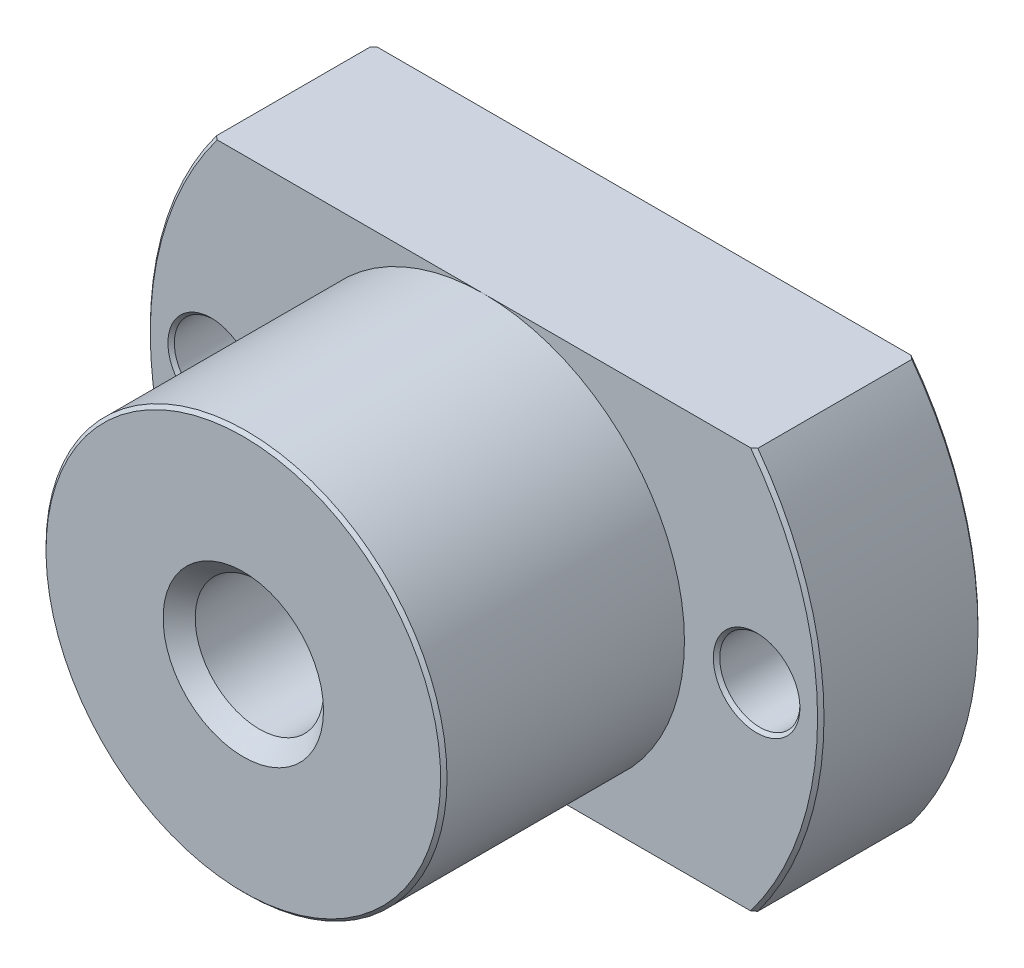
ISO-10303-21;
HEADER;
FILE_DESCRIPTION(('STEP AP214'),'2;1');
FILE_NAME('part.step','',(''),(''),'','','');
FILE_SCHEMA(('AUTOMOTIVE_DESIGN { 1 0 10303 214 1 1 1 1 }'));
ENDSEC;
DATA;
#1=APPLICATION_CONTEXT('core data for automotive mechanical design processes');
#2=APPLICATION_PROTOCOL_DEFINITION('international standard','automotive_design',2000,#1);
#3=PRODUCT_CONTEXT('',#1,'mechanical');
#4=PRODUCT('Part','Part','',(#3));
#5=PRODUCT_RELATED_PRODUCT_CATEGORY('part','',(#4));
#6=PRODUCT_DEFINITION_FORMATION('','',#4);
#7=PRODUCT_DEFINITION_CONTEXT('part definition',#1,'design');
#8=PRODUCT_DEFINITION('design','',#6,#7);
#9=PRODUCT_DEFINITION_SHAPE('','',#8);
#10=(LENGTH_UNIT() NAMED_UNIT(*) SI_UNIT(.MILLI.,.METRE.));
#11=(NAMED_UNIT(*) PLANE_ANGLE_UNIT() SI_UNIT($,.RADIAN.));
#12=(NAMED_UNIT(*) SI_UNIT($,.STERADIAN.) SOLID_ANGLE_UNIT());
#13=UNCERTAINTY_MEASURE_WITH_UNIT(LENGTH_MEASURE(1.E-05),#10,'distance_accuracy_value','');
#14=(GEOMETRIC_REPRESENTATION_CONTEXT(3) GLOBAL_UNCERTAINTY_ASSIGNED_CONTEXT((#13)) GLOBAL_UNIT_ASSIGNED_CONTEXT((#10,
#11,#12)) REPRESENTATION_CONTEXT('',''));
#15=CARTESIAN_POINT('',(0.,0.,0.));
#16=DIRECTION('',(0.,0.,1.));
#17=DIRECTION('',(1.,0.,0.));
#18=AXIS2_PLACEMENT_3D('',#15,#16,#17);
#19=CARTESIAN_POINT('',(0.,0.,24.8));
#20=DIRECTION('',(0.,0.,-1.));
#21=DIRECTION('',(0.,1.,0.));
#22=AXIS2_PLACEMENT_3D('',#19,#20,#21);
#23=CONICAL_SURFACE('',#22,12.5,0.785398163397448);
#24=CARTESIAN_POINT('',(0.,0.,25.));
#25=DIRECTION('',(0.,0.,-1.));
#26=DIRECTION('',(0.,1.,0.));
#27=AXIS2_PLACEMENT_3D('',#24,#25,#26);
#28=CIRCLE('',#27,12.3);
#29=CARTESIAN_POINT('',(0.,12.3,25.));
#30=VERTEX_POINT('',#29);
#31=EDGE_CURVE('E20',#30,#30,#28,.F.);
#32=ORIENTED_EDGE('',*,*,#31,.F.);
#33=EDGE_LOOP('',(#32));
#34=FACE_BOUND('',#33,.T.);
#35=CARTESIAN_POINT('',(0.,0.,24.8));
#36=DIRECTION('',(0.,0.,1.));
#37=DIRECTION('',(0.,-1.,0.));
#38=AXIS2_PLACEMENT_3D('',#35,#36,#37);
#39=CIRCLE('',#38,12.5);
#40=CARTESIAN_POINT('',(0.,-12.5,24.8));
#41=VERTEX_POINT('',#40);
#42=EDGE_CURVE('E95',#41,#41,#39,.F.);
#43=ORIENTED_EDGE('',*,*,#42,.F.);
#44=EDGE_LOOP('',(#43));
#45=FACE_BOUND('',#44,.T.);
#46=ADVANCED_FACE('F17',(#34,#45),#23,.T.);
#47=CARTESIAN_POINT('',(8.65,0.,25.));
#48=DIRECTION('',(0.,0.,1.));
#49=DIRECTION('',(0.,-1.,0.));
#50=AXIS2_PLACEMENT_3D('',#47,#48,#49);
#51=PLANE('',#50);
#52=ORIENTED_EDGE('',*,*,#31,.T.);
#53=EDGE_LOOP('',(#52));
#54=FACE_BOUND('',#53,.T.);
#55=CARTESIAN_POINT('',(0.,0.,24.9999999999773));
#56=DIRECTION('',(0.,0.,1.));
#57=DIRECTION('',(1.,0.,0.));
#58=AXIS2_PLACEMENT_3D('',#55,#56,#57);
#59=CIRCLE('',#58,4.99999999999545);
#60=CARTESIAN_POINT('',(4.99999999999545,0.,24.9999999999773));
#61=VERTEX_POINT('',#60);
#62=EDGE_CURVE('E142',#61,#61,#59,.F.);
#63=ORIENTED_EDGE('',*,*,#62,.T.);
#64=EDGE_LOOP('',(#63));
#65=FACE_BOUND('',#64,.T.);
#66=ADVANCED_FACE('F295',(#54,#65),#51,.T.);
#67=CARTESIAN_POINT('',(-17.,0.,10.0000000000477));
#68=DIRECTION('',(0.,0.,1.));
#69=DIRECTION('',(1.,0.,0.));
#70=AXIS2_PLACEMENT_3D('',#67,#68,#69);
#71=CONICAL_SURFACE('',#70,2.7000000000653,0.785398163397448);
#72=CARTESIAN_POINT('',(-17.,0.,10.0000000000477));
#73=DIRECTION('',(0.,0.,1.));
#74=DIRECTION('',(1.,0.,0.));
#75=AXIS2_PLACEMENT_3D('',#72,#73,#74);
#76=CIRCLE('',#75,2.7000000000653);
#77=CARTESIAN_POINT('',(-14.2999999999347,0.,10.0000000000477));
#78=VERTEX_POINT('',#77);
#79=EDGE_CURVE('E138',#78,#78,#76,.F.);
#80=ORIENTED_EDGE('',*,*,#79,.F.);
#81=EDGE_LOOP('',(#80));
#82=FACE_BOUND('',#81,.T.);
#83=CARTESIAN_POINT('',(-17.,0.,9.8));
#84=DIRECTION('',(0.,0.,1.));
#85=DIRECTION('',(0.,-1.,0.));
#86=AXIS2_PLACEMENT_3D('',#83,#84,#85);
#87=CIRCLE('',#86,2.5);
#88=CARTESIAN_POINT('',(-17.,-2.5,9.8));
#89=VERTEX_POINT('',#88);
#90=EDGE_CURVE('E135',#89,#89,#87,.F.);
#91=ORIENTED_EDGE('',*,*,#90,.T.);
#92=EDGE_LOOP('',(#91));
#93=FACE_BOUND('',#92,.T.);
#94=ADVANCED_FACE('F286',(#82,#93),#71,.F.);
#95=CARTESIAN_POINT('',(17.,0.,10.0000000000477));
#96=DIRECTION('',(0.,0.,1.));
#97=DIRECTION('',(1.,0.,0.));
#98=AXIS2_PLACEMENT_3D('',#95,#96,#97);
#99=CONICAL_SURFACE('',#98,2.7000000000653,0.785398163397448);
#100=CARTESIAN_POINT('',(17.,0.,10.0000000000477));
#101=DIRECTION('',(0.,0.,1.));
#102=DIRECTION('',(1.,0.,0.));
#103=AXIS2_PLACEMENT_3D('',#100,#101,#102);
#104=CIRCLE('',#103,2.7000000000653);
#105=CARTESIAN_POINT('',(19.7000000000653,0.,10.0000000000477));
#106=VERTEX_POINT('',#105);
#107=EDGE_CURVE('E106',#106,#106,#104,.F.);
#108=ORIENTED_EDGE('',*,*,#107,.F.);
#109=EDGE_LOOP('',(#108));
#110=FACE_BOUND('',#109,.T.);
#111=CARTESIAN_POINT('',(17.,0.,9.8));
#112=DIRECTION('',(0.,0.,1.));
#113=DIRECTION('',(0.,-1.,0.));
#114=AXIS2_PLACEMENT_3D('',#111,#112,#113);
#115=CIRCLE('',#114,2.5);
#116=CARTESIAN_POINT('',(17.,-2.5,9.8));
#117=VERTEX_POINT('',#116);
#118=EDGE_CURVE('E139',#117,#117,#115,.F.);
#119=ORIENTED_EDGE('',*,*,#118,.T.);
#120=EDGE_LOOP('',(#119));
#121=FACE_BOUND('',#120,.T.);
#122=ADVANCED_FACE('F283',(#110,#121),#99,.F.);
#123=CARTESIAN_POINT('',(0.,0.,17.4));
#124=DIRECTION('',(0.,0.,1.));
#125=DIRECTION('',(0.,-1.,0.));
#126=AXIS2_PLACEMENT_3D('',#123,#124,#125);
#127=CYLINDRICAL_SURFACE('',#126,12.5);
#128=ORIENTED_EDGE('',*,*,#42,.T.);
#129=EDGE_LOOP('',(#128));
#130=FACE_BOUND('',#129,.T.);
#131=CARTESIAN_POINT('',(0.,0.,10.));
#132=DIRECTION('',(0.,0.,1.));
#133=DIRECTION('',(0.,-1.,0.));
#134=AXIS2_PLACEMENT_3D('',#131,#132,#133);
#135=CIRCLE('',#134,12.5);
#136=CARTESIAN_POINT('',(0.,-12.5,10.));
#137=VERTEX_POINT('',#136);
#138=CARTESIAN_POINT('',(0.,12.5,10.));
#139=VERTEX_POINT('',#138);
#140=EDGE_CURVE('E107',#137,#139,#135,.F.);
#141=ORIENTED_EDGE('',*,*,#140,.F.);
#142=CARTESIAN_POINT('',(0.,0.,10.));
#143=DIRECTION('',(0.,0.,1.));
#144=DIRECTION('',(0.,-1.,0.));
#145=AXIS2_PLACEMENT_3D('',#142,#143,#144);
#146=CIRCLE('',#145,12.5);
#147=EDGE_CURVE('E132',#139,#137,#146,.F.);
#148=ORIENTED_EDGE('',*,*,#147,.F.);
#149=EDGE_LOOP('',(#141,#148));
#150=FACE_BOUND('',#149,.T.);
#151=ADVANCED_FACE('F285',(#130,#150),#127,.T.);
#152=CARTESIAN_POINT('',(0.,0.,9.8));
#153=DIRECTION('',(0.,0.,-1.));
#154=DIRECTION('',(0.,1.,0.));
#155=AXIS2_PLACEMENT_3D('',#152,#153,#154);
#156=CONICAL_SURFACE('',#155,21.,0.78539816339744);
#157=CARTESIAN_POINT('',(-16.6249812029969,12.5,10.));
#158=CARTESIAN_POINT('',(-16.6666171887382,12.5,9.96672075496622));
#159=CARTESIAN_POINT('',(-16.7082315006251,12.5,9.93341446574889));
#160=CARTESIAN_POINT('',(-16.7914167765213,12.5,9.86674779908201));
#161=CARTESIAN_POINT('',(-16.8329877405309,12.5,9.83338742163267));
#162=CARTESIAN_POINT('',(-16.8745370306862,12.5,9.8));
#163=B_SPLINE_CURVE_WITH_KNOTS('',3,(#157,#158,#159,#160,#161,#162),.UNSPECIFIED.,.F.,.F.,(4,2,
4),(0.,0.159904780094797,0.31980955954266),.UNSPECIFIED.);
#164=CARTESIAN_POINT('',(-16.6249812029969,12.5,10.));
#165=VERTEX_POINT('',#164);
#166=CARTESIAN_POINT('',(-16.8745370306862,12.5,9.8));
#167=VERTEX_POINT('',#166);
#168=EDGE_CURVE('E144',#165,#167,#163,.T.);
#169=ORIENTED_EDGE('',*,*,#168,.T.);
#170=CARTESIAN_POINT('',(0.,0.,9.8));
#171=DIRECTION('',(0.,0.,1.));
#172=DIRECTION('',(0.,-1.,0.));
#173=AXIS2_PLACEMENT_3D('',#170,#171,#172);
#174=CIRCLE('',#173,21.);
#175=CARTESIAN_POINT('',(-16.8745370306862,-12.5,9.8));
#176=VERTEX_POINT('',#175);
#177=EDGE_CURVE('E84',#176,#167,#174,.F.);
#178=ORIENTED_EDGE('',*,*,#177,.F.);
#179=CARTESIAN_POINT('',(-16.8745370306862,-12.5,9.8));
#180=CARTESIAN_POINT('',(-16.8329877405309,-12.5,9.83338742163267));
#181=CARTESIAN_POINT('',(-16.7914167765213,-12.5,9.86674779908201));
#182=CARTESIAN_POINT('',(-16.7082315006251,-12.5,9.93341446574889));
#183=CARTESIAN_POINT('',(-16.6666171887382,-12.5,9.96672075496622));
#184=CARTESIAN_POINT('',(-16.6249812029969,-12.5,10.));
#185=B_SPLINE_CURVE_WITH_KNOTS('',3,(#179,#180,#181,#182,#183,#184),.UNSPECIFIED.,.F.,.F.,(4,2,
4),(0.,0.159904779447861,0.319809559542655),.UNSPECIFIED.);
#186=CARTESIAN_POINT('',(-16.6249812029969,-12.5,10.));
#187=VERTEX_POINT('',#186);
#188=EDGE_CURVE('E86',#176,#187,#185,.T.);
#189=ORIENTED_EDGE('',*,*,#188,.T.);
#190=CARTESIAN_POINT('',(0.,0.,10.));
#191=DIRECTION('',(0.,0.,-1.));
#192=DIRECTION('',(0.,1.,0.));
#193=AXIS2_PLACEMENT_3D('',#190,#191,#192);
#194=CIRCLE('',#193,20.8);
#195=EDGE_CURVE('E89',#165,#187,#194,.F.);
#196=ORIENTED_EDGE('',*,*,#195,.F.);
#197=EDGE_LOOP('',(#169,#178,#189,#196));
#198=FACE_BOUND('',#197,.T.);
#199=ADVANCED_FACE('F88',(#198),#156,.T.);
#200=CARTESIAN_POINT('',(0.,0.,9.8));
#201=DIRECTION('',(0.,0.,-1.));
#202=DIRECTION('',(0.,1.,0.));
#203=AXIS2_PLACEMENT_3D('',#200,#201,#202);
#204=CONICAL_SURFACE('',#203,21.,0.78539816339744);
#205=CARTESIAN_POINT('',(16.6249812029969,-12.5,10.));
#206=CARTESIAN_POINT('',(16.6666171887382,-12.5,9.96672075496622));
#207=CARTESIAN_POINT('',(16.7082315006251,-12.5,9.93341446574889));
#208=CARTESIAN_POINT('',(16.7914167765213,-12.5,9.86674779908201));
#209=CARTESIAN_POINT('',(16.8329877405309,-12.5,9.83338742163267));
#210=CARTESIAN_POINT('',(16.8745370306862,-12.5,9.8));
#211=B_SPLINE_CURVE_WITH_KNOTS('',3,(#205,#206,#207,#208,#209,#210),.UNSPECIFIED.,.F.,.F.,(4,2,
4),(0.,0.159904780094797,0.319809559542658),.UNSPECIFIED.);
#212=CARTESIAN_POINT('',(16.6249812029969,-12.5,10.));
#213=VERTEX_POINT('',#212);
#214=CARTESIAN_POINT('',(16.8745370306862,-12.5,9.8));
#215=VERTEX_POINT('',#214);
#216=EDGE_CURVE('E189',#213,#215,#211,.T.);
#217=ORIENTED_EDGE('',*,*,#216,.T.);
#218=CARTESIAN_POINT('',(0.,0.,9.8));
#219=DIRECTION('',(0.,0.,1.));
#220=DIRECTION('',(0.,-1.,0.));
#221=AXIS2_PLACEMENT_3D('',#218,#219,#220);
#222=CIRCLE('',#221,21.);
#223=CARTESIAN_POINT('',(16.8745370306862,12.5,9.8));
#224=VERTEX_POINT('',#223);
#225=EDGE_CURVE('E130',#224,#215,#222,.F.);
#226=ORIENTED_EDGE('',*,*,#225,.F.);
#227=CARTESIAN_POINT('',(16.8745370306862,12.5,9.8));
#228=CARTESIAN_POINT('',(16.8329877405309,12.5,9.83338742163267));
#229=CARTESIAN_POINT('',(16.7914167765213,12.5,9.86674779908201));
#230=CARTESIAN_POINT('',(16.7082315006251,12.5,9.93341446574889));
#231=CARTESIAN_POINT('',(16.6666171887382,12.5,9.96672075496622));
#232=CARTESIAN_POINT('',(16.6249812029969,12.5,9.99999999999999));
#233=B_SPLINE_CURVE_WITH_KNOTS('',3,(#227,#228,#229,#230,#231,#232),.UNSPECIFIED.,.F.,.F.,(4,2,
4),(0.,0.159904779447861,0.319809559542654),.UNSPECIFIED.);
#234=CARTESIAN_POINT('',(16.6249812029969,12.5,10.));
#235=VERTEX_POINT('',#234);
#236=EDGE_CURVE('E221',#224,#235,#233,.T.);
#237=ORIENTED_EDGE('',*,*,#236,.T.);
#238=CARTESIAN_POINT('',(0.,0.,10.));
#239=DIRECTION('',(0.,0.,-1.));
#240=DIRECTION('',(0.,1.,0.));
#241=AXIS2_PLACEMENT_3D('',#238,#239,#240);
#242=CIRCLE('',#241,20.8);
#243=EDGE_CURVE('E211',#213,#235,#242,.F.);
#244=ORIENTED_EDGE('',*,*,#243,.F.);
#245=EDGE_LOOP('',(#217,#226,#237,#244));
#246=FACE_BOUND('',#245,.T.);
#247=ADVANCED_FACE('F233',(#246),#204,.T.);
#248=CARTESIAN_POINT('',(0.,0.,24.9999999999773));
#249=DIRECTION('',(0.,0.,1.));
#250=DIRECTION('',(1.,0.,0.));
#251=AXIS2_PLACEMENT_3D('',#248,#249,#250);
#252=CONICAL_SURFACE('',#251,4.99999999999545,0.785398163397448);
#253=CARTESIAN_POINT('',(0.,0.,24.));
#254=DIRECTION('',(0.,0.,1.));
#255=DIRECTION('',(0.,-1.,0.));
#256=AXIS2_PLACEMENT_3D('',#253,#254,#255);
#257=CIRCLE('',#256,4.);
#258=CARTESIAN_POINT('',(0.,-4.,24.));
#259=VERTEX_POINT('',#258);
#260=EDGE_CURVE('E127',#259,#259,#257,.F.);
#261=ORIENTED_EDGE('',*,*,#260,.T.);
#262=EDGE_LOOP('',(#261));
#263=FACE_BOUND('',#262,.T.);
#264=ORIENTED_EDGE('',*,*,#62,.F.);
#265=EDGE_LOOP('',(#264));
#266=FACE_BOUND('',#265,.T.);
#267=ADVANCED_FACE('F279',(#263,#266),#252,.F.);
#268=CARTESIAN_POINT('',(17.,0.,5.));
#269=DIRECTION('',(0.,0.,1.));
#270=DIRECTION('',(0.,-1.,0.));
#271=AXIS2_PLACEMENT_3D('',#268,#269,#270);
#272=CYLINDRICAL_SURFACE('',#271,2.5);
#273=CARTESIAN_POINT('',(17.,0.,0.200000000006639));
#274=DIRECTION('',(0.,0.,-1.));
#275=DIRECTION('',(-1.,0.,0.));
#276=AXIS2_PLACEMENT_3D('',#273,#274,#275);
#277=CIRCLE('',#276,2.49999999994498);
#278=CARTESIAN_POINT('',(14.500000000055,0.,0.200000000006639));
#279=VERTEX_POINT('',#278);
#280=EDGE_CURVE('E124',#279,#279,#277,.T.);
#281=ORIENTED_EDGE('',*,*,#280,.T.);
#282=EDGE_LOOP('',(#281));
#283=FACE_BOUND('',#282,.T.);
#284=ORIENTED_EDGE('',*,*,#118,.F.);
#285=EDGE_LOOP('',(#284));
#286=FACE_BOUND('',#285,.T.);
#287=ADVANCED_FACE('F275',(#283,#286),#272,.F.);
#288=CARTESIAN_POINT('',(-17.,0.,5.));
#289=DIRECTION('',(0.,0.,1.));
#290=DIRECTION('',(0.,-1.,0.));
#291=AXIS2_PLACEMENT_3D('',#288,#289,#290);
#292=CYLINDRICAL_SURFACE('',#291,2.5);
#293=CARTESIAN_POINT('',(-17.,0.,0.200000000006639));
#294=DIRECTION('',(0.,0.,-1.));
#295=DIRECTION('',(1.,0.,0.));
#296=AXIS2_PLACEMENT_3D('',#293,#294,#295);
#297=CIRCLE('',#296,2.49999999994498);
#298=CARTESIAN_POINT('',(-14.500000000055,0.,0.200000000006639));
#299=VERTEX_POINT('',#298);
#300=EDGE_CURVE('E118',#299,#299,#297,.T.);
#301=ORIENTED_EDGE('',*,*,#300,.T.);
#302=EDGE_LOOP('',(#301));
#303=FACE_BOUND('',#302,.T.);
#304=ORIENTED_EDGE('',*,*,#90,.F.);
#305=EDGE_LOOP('',(#304));
#306=FACE_BOUND('',#305,.T.);
#307=ADVANCED_FACE('F278',(#303,#306),#292,.F.);
#308=CARTESIAN_POINT('',(16.65,0.,10.));
#309=DIRECTION('',(0.,0.,1.));
#310=DIRECTION('',(0.,-1.,0.));
#311=AXIS2_PLACEMENT_3D('',#308,#309,#310);
#312=PLANE('',#311);
#313=DIRECTION('',(1.,0.,0.));
#314=VECTOR('',#313,1.);
#315=CARTESIAN_POINT('',(0.,12.5,10.));
#316=LINE('',#315,#314);
#317=EDGE_CURVE('E105',#165,#139,#316,.T.);
#318=ORIENTED_EDGE('',*,*,#317,.F.);
#319=ORIENTED_EDGE('',*,*,#195,.T.);
#320=DIRECTION('',(1.,0.,0.));
#321=VECTOR('',#320,1.);
#322=CARTESIAN_POINT('',(0.,-12.5,10.));
#323=LINE('',#322,#321);
#324=EDGE_CURVE('E102',#137,#187,#323,.F.);
#325=ORIENTED_EDGE('',*,*,#324,.F.);
#326=ORIENTED_EDGE('',*,*,#140,.T.);
#327=EDGE_LOOP('',(#318,#319,#325,#326));
#328=FACE_BOUND('',#327,.T.);
#329=ORIENTED_EDGE('',*,*,#79,.T.);
#330=EDGE_LOOP('',(#329));
#331=FACE_BOUND('',#330,.T.);
#332=ADVANCED_FACE('F99',(#328,#331),#312,.T.);
#333=CARTESIAN_POINT('',(16.65,0.,10.));
#334=DIRECTION('',(0.,0.,1.));
#335=DIRECTION('',(0.,-1.,0.));
#336=AXIS2_PLACEMENT_3D('',#333,#334,#335);
#337=PLANE('',#336);
#338=DIRECTION('',(1.,0.,0.));
#339=VECTOR('',#338,1.);
#340=CARTESIAN_POINT('',(0.,12.5,10.));
#341=LINE('',#340,#339);
#342=EDGE_CURVE('E315',#139,#235,#341,.T.);
#343=ORIENTED_EDGE('',*,*,#342,.F.);
#344=ORIENTED_EDGE('',*,*,#147,.T.);
#345=DIRECTION('',(1.,0.,0.));
#346=VECTOR('',#345,1.);
#347=CARTESIAN_POINT('',(0.,-12.5,10.));
#348=LINE('',#347,#346);
#349=EDGE_CURVE('E113',#213,#137,#348,.F.);
#350=ORIENTED_EDGE('',*,*,#349,.F.);
#351=ORIENTED_EDGE('',*,*,#243,.T.);
#352=EDGE_LOOP('',(#343,#344,#350,#351));
#353=FACE_BOUND('',#352,.T.);
#354=ORIENTED_EDGE('',*,*,#107,.T.);
#355=EDGE_LOOP('',(#354));
#356=FACE_BOUND('',#355,.T.);
#357=ADVANCED_FACE('F312',(#353,#356),#337,.T.);
#358=CARTESIAN_POINT('',(0.,0.,5.));
#359=DIRECTION('',(0.,0.,1.));
#360=DIRECTION('',(0.,-1.,0.));
#361=AXIS2_PLACEMENT_3D('',#358,#359,#360);
#362=CYLINDRICAL_SURFACE('',#361,21.);
#363=DIRECTION('',(0.,0.,1.));
#364=VECTOR('',#363,1.);
#365=CARTESIAN_POINT('',(-16.8745370306862,12.5,5.));
#366=LINE('',#365,#364);
#367=CARTESIAN_POINT('',(-16.8745370306862,12.5,0.2));
#368=VERTEX_POINT('',#367);
#369=EDGE_CURVE('E323',#368,#167,#366,.T.);
#370=ORIENTED_EDGE('',*,*,#369,.F.);
#371=CARTESIAN_POINT('',(0.,0.,0.200000000000002));
#372=DIRECTION('',(0.,0.,1.));
#373=DIRECTION('',(1.,0.,0.));
#374=AXIS2_PLACEMENT_3D('',#371,#372,#373);
#375=CIRCLE('',#374,21.);
#376=CARTESIAN_POINT('',(-16.8745370306862,-12.5,0.199999999999999));
#377=VERTEX_POINT('',#376);
#378=EDGE_CURVE('E204',#377,#368,#375,.F.);
#379=ORIENTED_EDGE('',*,*,#378,.F.);
#380=DIRECTION('',(0.,0.,-1.));
#381=VECTOR('',#380,1.);
#382=CARTESIAN_POINT('',(-16.8745370306862,-12.5,5.));
#383=LINE('',#382,#381);
#384=EDGE_CURVE('E114',#176,#377,#383,.T.);
#385=ORIENTED_EDGE('',*,*,#384,.F.);
#386=ORIENTED_EDGE('',*,*,#177,.T.);
#387=EDGE_LOOP('',(#370,#379,#385,#386));
#388=FACE_BOUND('',#387,.T.);
#389=ADVANCED_FACE('F346',(#388),#362,.T.);
#390=CARTESIAN_POINT('',(0.,0.,5.));
#391=DIRECTION('',(0.,0.,1.));
#392=DIRECTION('',(0.,-1.,0.));
#393=AXIS2_PLACEMENT_3D('',#390,#391,#392);
#394=CYLINDRICAL_SURFACE('',#393,21.);
#395=DIRECTION('',(0.,0.,-1.));
#396=VECTOR('',#395,1.);
#397=CARTESIAN_POINT('',(16.8745370306862,-12.5,5.));
#398=LINE('',#397,#396);
#399=CARTESIAN_POINT('',(16.8745370306862,-12.5,0.200000000000001));
#400=VERTEX_POINT('',#399);
#401=EDGE_CURVE('E116',#400,#215,#398,.F.);
#402=ORIENTED_EDGE('',*,*,#401,.F.);
#403=CARTESIAN_POINT('',(0.,0.,0.200000000000002));
#404=DIRECTION('',(0.,0.,1.));
#405=DIRECTION('',(1.,0.,0.));
#406=AXIS2_PLACEMENT_3D('',#403,#404,#405);
#407=CIRCLE('',#406,21.);
#408=CARTESIAN_POINT('',(16.8745370306862,12.5,0.199999999999997));
#409=VERTEX_POINT('',#408);
#410=EDGE_CURVE('E167',#409,#400,#407,.F.);
#411=ORIENTED_EDGE('',*,*,#410,.F.);
#412=DIRECTION('',(0.,0.,1.));
#413=VECTOR('',#412,1.);
#414=CARTESIAN_POINT('',(16.8745370306862,12.5,5.));
#415=LINE('',#414,#413);
#416=EDGE_CURVE('E316',#224,#409,#415,.F.);
#417=ORIENTED_EDGE('',*,*,#416,.F.);
#418=ORIENTED_EDGE('',*,*,#225,.T.);
#419=EDGE_LOOP('',(#402,#411,#417,#418));
#420=FACE_BOUND('',#419,.T.);
#421=ADVANCED_FACE('F331',(#420),#394,.T.);
#422=CARTESIAN_POINT('',(0.,0.,12.5));
#423=DIRECTION('',(0.,0.,1.));
#424=DIRECTION('',(0.,-1.,0.));
#425=AXIS2_PLACEMENT_3D('',#422,#423,#424);
#426=CYLINDRICAL_SURFACE('',#425,4.);
#427=CARTESIAN_POINT('',(0.,0.,0.999999999976353));
#428=DIRECTION('',(0.,0.,-1.));
#429=DIRECTION('',(1.,0.,0.));
#430=AXIS2_PLACEMENT_3D('',#427,#428,#429);
#431=CIRCLE('',#430,4.0000000000191);
#432=CARTESIAN_POINT('',(4.0000000000191,0.,0.999999999976353));
#433=VERTEX_POINT('',#432);
#434=EDGE_CURVE('E158',#433,#433,#431,.T.);
#435=ORIENTED_EDGE('',*,*,#434,.T.);
#436=EDGE_LOOP('',(#435));
#437=FACE_BOUND('',#436,.T.);
#438=ORIENTED_EDGE('',*,*,#260,.F.);
#439=EDGE_LOOP('',(#438));
#440=FACE_BOUND('',#439,.T.);
#441=ADVANCED_FACE('F272',(#437,#440),#426,.F.);
#442=CARTESIAN_POINT('',(17.,0.,0.));
#443=DIRECTION('',(0.,0.,-1.));
#444=DIRECTION('',(0.,1.,0.));
#445=AXIS2_PLACEMENT_3D('',#442,#443,#444);
#446=CONICAL_SURFACE('',#445,2.70000000000846,0.785398163539557);
#447=CARTESIAN_POINT('',(17.,0.,4.09394740214169E-12));
#448=DIRECTION('',(0.,0.,-1.));
#449=DIRECTION('',(0.,1.,0.));
#450=AXIS2_PLACEMENT_3D('',#447,#448,#449);
#451=CIRCLE('',#450,2.70000000000437);
#452=CARTESIAN_POINT('',(17.,2.70000000000437,4.09411272399946E-12));
#453=VERTEX_POINT('',#452);
#454=EDGE_CURVE('E155',#453,#453,#451,.F.);
#455=ORIENTED_EDGE('',*,*,#454,.F.);
#456=EDGE_LOOP('',(#455));
#457=FACE_BOUND('',#456,.T.);
#458=ORIENTED_EDGE('',*,*,#280,.F.);
#459=EDGE_LOOP('',(#458));
#460=FACE_BOUND('',#459,.T.);
#461=ADVANCED_FACE('F269',(#457,#460),#446,.F.);
#462=CARTESIAN_POINT('',(-17.,0.,0.));
#463=DIRECTION('',(0.,0.,-1.));
#464=DIRECTION('',(0.,1.,0.));
#465=AXIS2_PLACEMENT_3D('',#462,#463,#464);
#466=CONICAL_SURFACE('',#465,2.70000000000846,0.785398163539557);
#467=CARTESIAN_POINT('',(-17.,0.,4.09394740214169E-12));
#468=DIRECTION('',(0.,0.,-1.));
#469=DIRECTION('',(0.,1.,0.));
#470=AXIS2_PLACEMENT_3D('',#467,#468,#469);
#471=CIRCLE('',#470,2.70000000000437);
#472=CARTESIAN_POINT('',(-17.,2.70000000000437,4.09378208028393E-12));
#473=VERTEX_POINT('',#472);
#474=EDGE_CURVE('E152',#473,#473,#471,.F.);
#475=ORIENTED_EDGE('',*,*,#474,.F.);
#476=EDGE_LOOP('',(#475));
#477=FACE_BOUND('',#476,.T.);
#478=ORIENTED_EDGE('',*,*,#300,.F.);
#479=EDGE_LOOP('',(#478));
#480=FACE_BOUND('',#479,.T.);
#481=ADVANCED_FACE('F182',(#477,#480),#466,.F.);
#482=CARTESIAN_POINT('',(0.,-12.5,5.));
#483=DIRECTION('',(0.,-1.,0.));
#484=DIRECTION('',(0.,0.,-1.));
#485=AXIS2_PLACEMENT_3D('',#482,#483,#484);
#486=PLANE('',#485);
#487=CARTESIAN_POINT('',(16.8745370306862,-12.5,0.2));
#488=CARTESIAN_POINT('',(16.8329877405309,-12.5,0.166612578367332));
#489=CARTESIAN_POINT('',(16.7914167765213,-12.5,0.133252200917992));
#490=CARTESIAN_POINT('',(16.7082315006251,-12.5,0.0665855342511088));
#491=CARTESIAN_POINT('',(16.6666171887382,-12.5,0.0332792450337843));
#492=CARTESIAN_POINT('',(16.6249812029969,-12.5,0.));
#493=B_SPLINE_CURVE_WITH_KNOTS('',3,(#487,#488,#489,#490,#491,#492),.UNSPECIFIED.,.F.,.F.,(4,2,
4),(0.,0.159904779447861,0.319809559542656),.UNSPECIFIED.);
#494=CARTESIAN_POINT('',(16.6249812029969,-12.5,0.));
#495=VERTEX_POINT('',#494);
#496=EDGE_CURVE('E159',#400,#495,#493,.T.);
#497=ORIENTED_EDGE('',*,*,#496,.F.);
#498=ORIENTED_EDGE('',*,*,#401,.T.);
#499=ORIENTED_EDGE('',*,*,#216,.F.);
#500=ORIENTED_EDGE('',*,*,#349,.T.);
#501=ORIENTED_EDGE('',*,*,#324,.T.);
#502=ORIENTED_EDGE('',*,*,#188,.F.);
#503=ORIENTED_EDGE('',*,*,#384,.T.);
#504=CARTESIAN_POINT('',(-16.6249812029969,-12.5,0.));
#505=CARTESIAN_POINT('',(-16.6666171887382,-12.5,0.0332792450337858));
#506=CARTESIAN_POINT('',(-16.7082315006251,-12.5,0.0665855342511107));
#507=CARTESIAN_POINT('',(-16.7914167765213,-12.5,0.133252200917995));
#508=CARTESIAN_POINT('',(-16.8329877405309,-12.5,0.166612578367335));
#509=CARTESIAN_POINT('',(-16.8745370306862,-12.5,0.200000000000002));
#510=B_SPLINE_CURVE_WITH_KNOTS('',3,(#504,#505,#506,#507,#508,#509),.UNSPECIFIED.,.F.,.F.,(4,2,
4),(0.,0.159904780094798,0.319809559542659),.UNSPECIFIED.);
#511=CARTESIAN_POINT('',(-16.6249812029969,-12.5,0.));
#512=VERTEX_POINT('',#511);
#513=EDGE_CURVE('E198',#512,#377,#510,.T.);
#514=ORIENTED_EDGE('',*,*,#513,.F.);
#515=DIRECTION('',(1.,0.,0.));
#516=VECTOR('',#515,1.);
#517=CARTESIAN_POINT('',(12.9,-12.5,0.));
#518=LINE('',#517,#516);
#519=EDGE_CURVE('E151',#495,#512,#518,.F.);
#520=ORIENTED_EDGE('',*,*,#519,.F.);
#521=EDGE_LOOP('',(#497,#498,#499,#500,#501,#502,#503,#514,#520));
#522=FACE_BOUND('',#521,.T.);
#523=ADVANCED_FACE('F110',(#522),#486,.T.);
#524=CARTESIAN_POINT('',(0.,0.,0.200000000000004));
#525=DIRECTION('',(0.,0.,1.));
#526=DIRECTION('',(0.,-1.,0.));
#527=AXIS2_PLACEMENT_3D('',#524,#525,#526);
#528=CONICAL_SURFACE('',#527,21.,0.785398163397445);
#529=CARTESIAN_POINT('',(-16.6249812029969,12.5,0.));
#530=CARTESIAN_POINT('',(-16.6666171887382,12.5,0.033279245033783));
#531=CARTESIAN_POINT('',(-16.7082315006251,12.5,0.0665855342511073));
#532=CARTESIAN_POINT('',(-16.7914167765213,12.5,0.13325220091799));
#533=CARTESIAN_POINT('',(-16.8329877405309,12.5,0.16661257836733));
#534=CARTESIAN_POINT('',(-16.8745370306862,12.5,0.199999999999997));
#535=B_SPLINE_CURVE_WITH_KNOTS('',3,(#529,#530,#531,#532,#533,#534),.UNSPECIFIED.,.F.,.F.,(4,2,
4),(0.,0.159904780094794,0.319809559542655),.UNSPECIFIED.);
#536=CARTESIAN_POINT('',(-16.6249812029969,12.5,0.));
#537=VERTEX_POINT('',#536);
#538=EDGE_CURVE('E205',#537,#368,#535,.T.);
#539=ORIENTED_EDGE('',*,*,#538,.F.);
#540=CARTESIAN_POINT('',(0.,0.,0.));
#541=DIRECTION('',(0.,0.,1.));
#542=DIRECTION('',(0.,-1.,0.));
#543=AXIS2_PLACEMENT_3D('',#540,#541,#542);
#544=CIRCLE('',#543,20.8);
#545=EDGE_CURVE('E149',#512,#537,#544,.F.);
#546=ORIENTED_EDGE('',*,*,#545,.F.);
#547=ORIENTED_EDGE('',*,*,#513,.T.);
#548=ORIENTED_EDGE('',*,*,#378,.T.);
#549=EDGE_LOOP('',(#539,#546,#547,#548));
#550=FACE_BOUND('',#549,.T.);
#551=ADVANCED_FACE('F181',(#550),#528,.T.);
#552=CARTESIAN_POINT('',(0.,12.5,5.));
#553=DIRECTION('',(0.,1.,0.));
#554=DIRECTION('',(0.,0.,1.));
#555=AXIS2_PLACEMENT_3D('',#552,#553,#554);
#556=PLANE('',#555);
#557=ORIENTED_EDGE('',*,*,#538,.T.);
#558=ORIENTED_EDGE('',*,*,#369,.T.);
#559=ORIENTED_EDGE('',*,*,#168,.F.);
#560=ORIENTED_EDGE('',*,*,#317,.T.);
#561=ORIENTED_EDGE('',*,*,#342,.T.);
#562=ORIENTED_EDGE('',*,*,#236,.F.);
#563=ORIENTED_EDGE('',*,*,#416,.T.);
#564=CARTESIAN_POINT('',(16.6249812029969,12.5,0.));
#565=CARTESIAN_POINT('',(16.6666171887382,12.5,0.0332792450337819));
#566=CARTESIAN_POINT('',(16.7082315006251,12.5,0.0665855342511066));
#567=CARTESIAN_POINT('',(16.7914167765213,12.5,0.133252200917991));
#568=CARTESIAN_POINT('',(16.8329877405309,12.5,0.166612578367331));
#569=CARTESIAN_POINT('',(16.8745370306862,12.5,0.199999999999999));
#570=B_SPLINE_CURVE_WITH_KNOTS('',3,(#564,#565,#566,#567,#568,#569),.UNSPECIFIED.,.F.,.F.,(4,2,
4),(0.,0.159904780094797,0.319809559542659),.UNSPECIFIED.);
#571=CARTESIAN_POINT('',(16.6249812029969,12.5,0.));
#572=VERTEX_POINT('',#571);
#573=EDGE_CURVE('E35',#572,#409,#570,.T.);
#574=ORIENTED_EDGE('',*,*,#573,.F.);
#575=DIRECTION('',(1.,0.,0.));
#576=VECTOR('',#575,1.);
#577=CARTESIAN_POINT('',(12.9,12.5,0.));
#578=LINE('',#577,#576);
#579=EDGE_CURVE('E148',#537,#572,#578,.T.);
#580=ORIENTED_EDGE('',*,*,#579,.F.);
#581=EDGE_LOOP('',(#557,#558,#559,#560,#561,#562,#563,#574,#580));
#582=FACE_BOUND('',#581,.T.);
#583=ADVANCED_FACE('F236',(#582),#556,.T.);
#584=CARTESIAN_POINT('',(0.,0.,0.200000000000004));
#585=DIRECTION('',(0.,0.,1.));
#586=DIRECTION('',(0.,-1.,0.));
#587=AXIS2_PLACEMENT_3D('',#584,#585,#586);
#588=CONICAL_SURFACE('',#587,21.,0.785398163397445);
#589=ORIENTED_EDGE('',*,*,#496,.T.);
#590=CARTESIAN_POINT('',(0.,0.,0.));
#591=DIRECTION('',(0.,0.,1.));
#592=DIRECTION('',(0.,-1.,0.));
#593=AXIS2_PLACEMENT_3D('',#590,#591,#592);
#594=CIRCLE('',#593,20.8);
#595=EDGE_CURVE('E26',#572,#495,#594,.F.);
#596=ORIENTED_EDGE('',*,*,#595,.F.);
#597=ORIENTED_EDGE('',*,*,#573,.T.);
#598=ORIENTED_EDGE('',*,*,#410,.T.);
#599=EDGE_LOOP('',(#589,#596,#597,#598));
#600=FACE_BOUND('',#599,.T.);
#601=ADVANCED_FACE('F174',(#600),#588,.T.);
#602=CARTESIAN_POINT('',(0.,0.,1.13686837721616E-10));
#603=DIRECTION('',(0.,0.,-1.));
#604=DIRECTION('',(0.,1.,0.));
#605=AXIS2_PLACEMENT_3D('',#602,#603,#604);
#606=CONICAL_SURFACE('',#605,4.99999999988177,0.78539816342587);
#607=CARTESIAN_POINT('',(0.,0.,5.68434188640392E-11));
#608=DIRECTION('',(0.,0.,-1.));
#609=DIRECTION('',(0.,1.,0.));
#610=AXIS2_PLACEMENT_3D('',#607,#608,#609);
#611=CIRCLE('',#610,4.99999999993861);
#612=CARTESIAN_POINT('',(0.,4.99999999993861,5.68431127124507E-11));
#613=VERTEX_POINT('',#612);
#614=EDGE_CURVE('E11',#613,#613,#611,.F.);
#615=ORIENTED_EDGE('',*,*,#614,.F.);
#616=EDGE_LOOP('',(#615));
#617=FACE_BOUND('',#616,.T.);
#618=ORIENTED_EDGE('',*,*,#434,.F.);
#619=EDGE_LOOP('',(#618));
#620=FACE_BOUND('',#619,.T.);
#621=ADVANCED_FACE('F252',(#617,#620),#606,.F.);
#622=CARTESIAN_POINT('',(12.9,0.,0.));
#623=DIRECTION('',(0.,0.,-1.));
#624=DIRECTION('',(0.,1.,0.));
#625=AXIS2_PLACEMENT_3D('',#622,#623,#624);
#626=PLANE('',#625);
#627=ORIENTED_EDGE('',*,*,#614,.T.);
#628=EDGE_LOOP('',(#627));
#629=FACE_BOUND('',#628,.T.);
#630=ORIENTED_EDGE('',*,*,#595,.T.);
#631=ORIENTED_EDGE('',*,*,#519,.T.);
#632=ORIENTED_EDGE('',*,*,#545,.T.);
#633=ORIENTED_EDGE('',*,*,#579,.T.);
#634=EDGE_LOOP('',(#630,#631,#632,#633));
#635=FACE_BOUND('',#634,.T.);
#636=ORIENTED_EDGE('',*,*,#474,.T.);
#637=EDGE_LOOP('',(#636));
#638=FACE_BOUND('',#637,.T.);
#639=ORIENTED_EDGE('',*,*,#454,.T.);
#640=EDGE_LOOP('',(#639));
#641=FACE_BOUND('',#640,.T.);
#642=ADVANCED_FACE('F250',(#629,#635,#638,#641),#626,.T.);
#643=CLOSED_SHELL('',(#46,#66,#94,#122,#151,#199,#247,#267,#287,#307,#332,#357,#389,#421,#441,
#461,#481,#523,#551,#583,#601,#621,#642));
#644=MANIFOLD_SOLID_BREP('B1',#643);
#645=ADVANCED_BREP_SHAPE_REPRESENTATION('',(#18,#644),#14);
#646=SHAPE_DEFINITION_REPRESENTATION(#9,#645);
ENDSEC;
END-ISO-10303-21;
